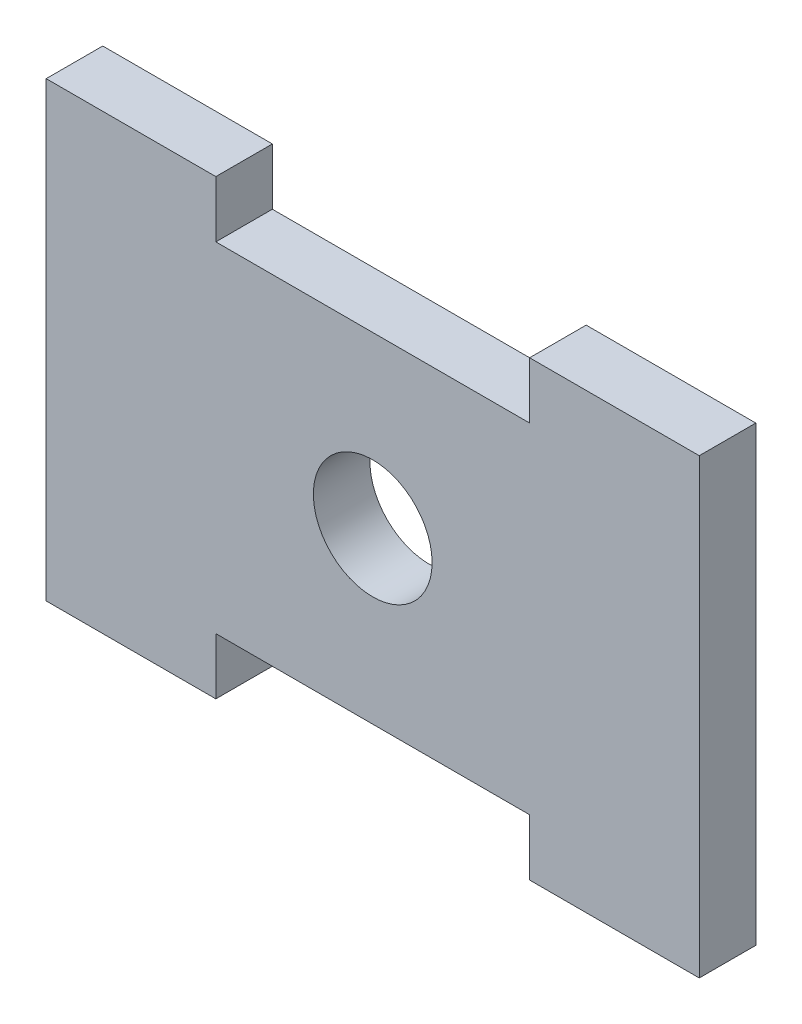
ISO-10303-21;
HEADER;
FILE_DESCRIPTION(('STEP AP214'),'2;1');
FILE_NAME('part.step','',(''),(''),'','','');
FILE_SCHEMA(('AUTOMOTIVE_DESIGN { 1 0 10303 214 1 1 1 1 }'));
ENDSEC;
DATA;
#1=APPLICATION_CONTEXT('core data for automotive mechanical design processes');
#2=APPLICATION_PROTOCOL_DEFINITION('international standard','automotive_design',2000,#1);
#3=PRODUCT_CONTEXT('',#1,'mechanical');
#4=PRODUCT('Part','Part','',(#3));
#5=PRODUCT_RELATED_PRODUCT_CATEGORY('part','',(#4));
#6=PRODUCT_DEFINITION_FORMATION('','',#4);
#7=PRODUCT_DEFINITION_CONTEXT('part definition',#1,'design');
#8=PRODUCT_DEFINITION('design','',#6,#7);
#9=PRODUCT_DEFINITION_SHAPE('','',#8);
#10=(LENGTH_UNIT() NAMED_UNIT(*) SI_UNIT(.MILLI.,.METRE.));
#11=(NAMED_UNIT(*) PLANE_ANGLE_UNIT() SI_UNIT($,.RADIAN.));
#12=(NAMED_UNIT(*) SI_UNIT($,.STERADIAN.) SOLID_ANGLE_UNIT());
#13=UNCERTAINTY_MEASURE_WITH_UNIT(LENGTH_MEASURE(1.E-05),#10,'distance_accuracy_value','');
#14=(GEOMETRIC_REPRESENTATION_CONTEXT(3) GLOBAL_UNCERTAINTY_ASSIGNED_CONTEXT((#13)) GLOBAL_UNIT_ASSIGNED_CONTEXT((#10,
#11,#12)) REPRESENTATION_CONTEXT('',''));
#15=CARTESIAN_POINT('',(0.,0.,0.));
#16=DIRECTION('',(0.,0.,1.));
#17=DIRECTION('',(1.,0.,0.));
#18=AXIS2_PLACEMENT_3D('',#15,#16,#17);
#19=CARTESIAN_POINT('',(0.,0.,2.));
#20=DIRECTION('',(0.,0.,-1.));
#21=DIRECTION('',(-1.,0.,0.));
#22=AXIS2_PLACEMENT_3D('',#19,#20,#21);
#23=PLANE('',#22);
#24=DIRECTION('',(-1.,0.,0.));
#25=VECTOR('',#24,1.);
#26=CARTESIAN_POINT('',(3.,-1.,2.));
#27=LINE('',#26,#25);
#28=CARTESIAN_POINT('',(14.1,-1.,2.));
#29=VERTEX_POINT('',#28);
#30=CARTESIAN_POINT('',(3.,-1.,2.));
#31=VERTEX_POINT('',#30);
#32=EDGE_CURVE('E201',#29,#31,#27,.T.);
#33=ORIENTED_EDGE('',*,*,#32,.T.);
#34=DIRECTION('',(0.,1.,0.));
#35=VECTOR('',#34,1.);
#36=CARTESIAN_POINT('',(3.,0.999999999999999,2.));
#37=LINE('',#36,#35);
#38=CARTESIAN_POINT('',(3.,0.999999999999999,2.));
#39=VERTEX_POINT('',#38);
#40=EDGE_CURVE('E112',#31,#39,#37,.T.);
#41=ORIENTED_EDGE('',*,*,#40,.T.);
#42=DIRECTION('',(-1.,0.,0.));
#43=VECTOR('',#42,1.);
#44=CARTESIAN_POINT('',(-3.,0.999999999999999,2.));
#45=LINE('',#44,#43);
#46=CARTESIAN_POINT('',(-3.,0.999999999999999,2.));
#47=VERTEX_POINT('',#46);
#48=EDGE_CURVE('E238',#39,#47,#45,.T.);
#49=ORIENTED_EDGE('',*,*,#48,.T.);
#50=DIRECTION('',(0.,-1.,0.));
#51=VECTOR('',#50,1.);
#52=CARTESIAN_POINT('',(-3.,0.999999999999999,2.));
#53=LINE('',#52,#51);
#54=CARTESIAN_POINT('',(-3.,-15.,2.));
#55=VERTEX_POINT('',#54);
#56=EDGE_CURVE('E257',#47,#55,#53,.T.);
#57=ORIENTED_EDGE('',*,*,#56,.T.);
#58=DIRECTION('',(1.,0.,0.));
#59=VECTOR('',#58,1.);
#60=CARTESIAN_POINT('',(-3.,-15.,2.));
#61=LINE('',#60,#59);
#62=CARTESIAN_POINT('',(3.,-15.,2.));
#63=VERTEX_POINT('',#62);
#64=EDGE_CURVE('E253',#55,#63,#61,.T.);
#65=ORIENTED_EDGE('',*,*,#64,.T.);
#66=DIRECTION('',(0.,1.,0.));
#67=VECTOR('',#66,1.);
#68=CARTESIAN_POINT('',(3.,-15.,2.));
#69=LINE('',#68,#67);
#70=CARTESIAN_POINT('',(3.,-13.,2.));
#71=VERTEX_POINT('',#70);
#72=EDGE_CURVE('E256',#63,#71,#69,.T.);
#73=ORIENTED_EDGE('',*,*,#72,.T.);
#74=DIRECTION('',(1.,0.,0.));
#75=VECTOR('',#74,1.);
#76=CARTESIAN_POINT('',(3.,-13.,2.));
#77=LINE('',#76,#75);
#78=CARTESIAN_POINT('',(14.1,-13.,2.));
#79=VERTEX_POINT('',#78);
#80=EDGE_CURVE('E261',#71,#79,#77,.T.);
#81=ORIENTED_EDGE('',*,*,#80,.T.);
#82=DIRECTION('',(0.,-1.,0.));
#83=VECTOR('',#82,1.);
#84=CARTESIAN_POINT('',(14.1,-15.,2.));
#85=LINE('',#84,#83);
#86=CARTESIAN_POINT('',(14.1,-15.,2.));
#87=VERTEX_POINT('',#86);
#88=EDGE_CURVE('E268',#79,#87,#85,.T.);
#89=ORIENTED_EDGE('',*,*,#88,.T.);
#90=DIRECTION('',(1.,0.,0.));
#91=VECTOR('',#90,1.);
#92=CARTESIAN_POINT('',(20.1,-15.,2.));
#93=LINE('',#92,#91);
#94=CARTESIAN_POINT('',(20.1,-15.,2.));
#95=VERTEX_POINT('',#94);
#96=EDGE_CURVE('E143',#87,#95,#93,.T.);
#97=ORIENTED_EDGE('',*,*,#96,.T.);
#98=DIRECTION('',(0.,1.,0.));
#99=VECTOR('',#98,1.);
#100=CARTESIAN_POINT('',(20.1,-15.,2.));
#101=LINE('',#100,#99);
#102=CARTESIAN_POINT('',(20.1,0.999999999999999,2.));
#103=VERTEX_POINT('',#102);
#104=EDGE_CURVE('E137',#95,#103,#101,.T.);
#105=ORIENTED_EDGE('',*,*,#104,.T.);
#106=DIRECTION('',(-1.,0.,0.));
#107=VECTOR('',#106,1.);
#108=CARTESIAN_POINT('',(20.1,0.999999999999999,2.));
#109=LINE('',#108,#107);
#110=CARTESIAN_POINT('',(14.1,0.999999999999999,2.));
#111=VERTEX_POINT('',#110);
#112=EDGE_CURVE('E141',#103,#111,#109,.T.);
#113=ORIENTED_EDGE('',*,*,#112,.T.);
#114=DIRECTION('',(0.,-1.,0.));
#115=VECTOR('',#114,1.);
#116=CARTESIAN_POINT('',(14.1,0.999999999999999,2.));
#117=LINE('',#116,#115);
#118=EDGE_CURVE('E57',#111,#29,#117,.T.);
#119=ORIENTED_EDGE('',*,*,#118,.T.);
#120=EDGE_LOOP('',(#33,#41,#49,#57,#65,#73,#81,#89,#97,#105,#113,#119));
#121=FACE_BOUND('',#120,.T.);
#122=CARTESIAN_POINT('',(8.55,-7.,2.));
#123=DIRECTION('',(0.,0.,1.));
#124=DIRECTION('',(1.,0.,0.));
#125=AXIS2_PLACEMENT_3D('',#122,#123,#124);
#126=CIRCLE('',#125,2.1);
#127=CARTESIAN_POINT('',(10.65,-7.,2.));
#128=VERTEX_POINT('',#127);
#129=EDGE_CURVE('E169',#128,#128,#126,.T.);
#130=ORIENTED_EDGE('',*,*,#129,.F.);
#131=EDGE_LOOP('',(#130));
#132=FACE_BOUND('',#131,.T.);
#133=ADVANCED_FACE('F39',(#121,#132),#23,.F.);
#134=CARTESIAN_POINT('',(0.,0.,0.));
#135=DIRECTION('',(0.,0.,-1.));
#136=DIRECTION('',(-1.,0.,0.));
#137=AXIS2_PLACEMENT_3D('',#134,#135,#136);
#138=PLANE('',#137);
#139=DIRECTION('',(-1.,0.,0.));
#140=VECTOR('',#139,1.);
#141=CARTESIAN_POINT('',(3.,-1.,0.));
#142=LINE('',#141,#140);
#143=CARTESIAN_POINT('',(14.1,-1.,0.));
#144=VERTEX_POINT('',#143);
#145=CARTESIAN_POINT('',(3.,-1.,0.));
#146=VERTEX_POINT('',#145);
#147=EDGE_CURVE('E164',#144,#146,#142,.T.);
#148=ORIENTED_EDGE('',*,*,#147,.F.);
#149=DIRECTION('',(0.,-1.,0.));
#150=VECTOR('',#149,1.);
#151=CARTESIAN_POINT('',(14.1,0.999999999999999,0.));
#152=LINE('',#151,#150);
#153=CARTESIAN_POINT('',(14.1,0.999999999999999,0.));
#154=VERTEX_POINT('',#153);
#155=EDGE_CURVE('E104',#154,#144,#152,.T.);
#156=ORIENTED_EDGE('',*,*,#155,.F.);
#157=DIRECTION('',(-1.,0.,0.));
#158=VECTOR('',#157,1.);
#159=CARTESIAN_POINT('',(20.1,0.999999999999999,0.));
#160=LINE('',#159,#158);
#161=CARTESIAN_POINT('',(20.1,0.999999999999999,0.));
#162=VERTEX_POINT('',#161);
#163=EDGE_CURVE('E98',#162,#154,#160,.T.);
#164=ORIENTED_EDGE('',*,*,#163,.F.);
#165=DIRECTION('',(0.,1.,0.));
#166=VECTOR('',#165,1.);
#167=CARTESIAN_POINT('',(20.1,0.999999999999999,0.));
#168=LINE('',#167,#166);
#169=CARTESIAN_POINT('',(20.1,-15.,0.));
#170=VERTEX_POINT('',#169);
#171=EDGE_CURVE('E151',#170,#162,#168,.T.);
#172=ORIENTED_EDGE('',*,*,#171,.F.);
#173=DIRECTION('',(1.,0.,0.));
#174=VECTOR('',#173,1.);
#175=CARTESIAN_POINT('',(20.1,-15.,0.));
#176=LINE('',#175,#174);
#177=CARTESIAN_POINT('',(14.1,-15.,0.));
#178=VERTEX_POINT('',#177);
#179=EDGE_CURVE('E191',#178,#170,#176,.T.);
#180=ORIENTED_EDGE('',*,*,#179,.F.);
#181=DIRECTION('',(0.,-1.,0.));
#182=VECTOR('',#181,1.);
#183=CARTESIAN_POINT('',(14.1,-15.,0.));
#184=LINE('',#183,#182);
#185=CARTESIAN_POINT('',(14.1,-13.,0.));
#186=VERTEX_POINT('',#185);
#187=EDGE_CURVE('E188',#186,#178,#184,.T.);
#188=ORIENTED_EDGE('',*,*,#187,.F.);
#189=DIRECTION('',(1.,0.,0.));
#190=VECTOR('',#189,1.);
#191=CARTESIAN_POINT('',(3.,-13.,0.));
#192=LINE('',#191,#190);
#193=CARTESIAN_POINT('',(3.,-13.,0.));
#194=VERTEX_POINT('',#193);
#195=EDGE_CURVE('E185',#194,#186,#192,.T.);
#196=ORIENTED_EDGE('',*,*,#195,.F.);
#197=DIRECTION('',(0.,1.,0.));
#198=VECTOR('',#197,1.);
#199=CARTESIAN_POINT('',(3.,-15.,0.));
#200=LINE('',#199,#198);
#201=CARTESIAN_POINT('',(3.,-15.,0.));
#202=VERTEX_POINT('',#201);
#203=EDGE_CURVE('E182',#202,#194,#200,.T.);
#204=ORIENTED_EDGE('',*,*,#203,.F.);
#205=DIRECTION('',(1.,0.,0.));
#206=VECTOR('',#205,1.);
#207=CARTESIAN_POINT('',(-3.,-15.,0.));
#208=LINE('',#207,#206);
#209=CARTESIAN_POINT('',(-3.,-15.,0.));
#210=VERTEX_POINT('',#209);
#211=EDGE_CURVE('E179',#210,#202,#208,.T.);
#212=ORIENTED_EDGE('',*,*,#211,.F.);
#213=DIRECTION('',(0.,-1.,0.));
#214=VECTOR('',#213,1.);
#215=CARTESIAN_POINT('',(-3.,-15.,0.));
#216=LINE('',#215,#214);
#217=CARTESIAN_POINT('',(-3.,0.999999999999999,0.));
#218=VERTEX_POINT('',#217);
#219=EDGE_CURVE('E176',#218,#210,#216,.T.);
#220=ORIENTED_EDGE('',*,*,#219,.F.);
#221=DIRECTION('',(-1.,0.,0.));
#222=VECTOR('',#221,1.);
#223=CARTESIAN_POINT('',(-3.,0.999999999999999,0.));
#224=LINE('',#223,#222);
#225=CARTESIAN_POINT('',(3.,0.999999999999999,0.));
#226=VERTEX_POINT('',#225);
#227=EDGE_CURVE('E172',#226,#218,#224,.T.);
#228=ORIENTED_EDGE('',*,*,#227,.F.);
#229=DIRECTION('',(0.,1.,0.));
#230=VECTOR('',#229,1.);
#231=CARTESIAN_POINT('',(3.,0.999999999999999,0.));
#232=LINE('',#231,#230);
#233=EDGE_CURVE('E168',#146,#226,#232,.T.);
#234=ORIENTED_EDGE('',*,*,#233,.F.);
#235=EDGE_LOOP('',(#148,#156,#164,#172,#180,#188,#196,#204,#212,#220,#228,#234));
#236=FACE_BOUND('',#235,.T.);
#237=CARTESIAN_POINT('',(8.55,-7.,0.));
#238=DIRECTION('',(0.,0.,1.));
#239=DIRECTION('',(1.,0.,0.));
#240=AXIS2_PLACEMENT_3D('',#237,#238,#239);
#241=CIRCLE('',#240,2.1);
#242=CARTESIAN_POINT('',(10.65,-7.,0.));
#243=VERTEX_POINT('',#242);
#244=EDGE_CURVE('E429',#243,#243,#241,.T.);
#245=ORIENTED_EDGE('',*,*,#244,.T.);
#246=EDGE_LOOP('',(#245));
#247=FACE_BOUND('',#246,.T.);
#248=ADVANCED_FACE('F241',(#236,#247),#138,.T.);
#249=CARTESIAN_POINT('',(3.,-1.,2.));
#250=DIRECTION('',(0.,-1.,0.));
#251=DIRECTION('',(0.,0.,-1.));
#252=AXIS2_PLACEMENT_3D('',#249,#250,#251);
#253=PLANE('',#252);
#254=ORIENTED_EDGE('',*,*,#147,.T.);
#255=DIRECTION('',(0.,0.,-1.));
#256=VECTOR('',#255,1.);
#257=CARTESIAN_POINT('',(3.,-1.,2.));
#258=LINE('',#257,#256);
#259=EDGE_CURVE('E11',#31,#146,#258,.T.);
#260=ORIENTED_EDGE('',*,*,#259,.F.);
#261=ORIENTED_EDGE('',*,*,#32,.F.);
#262=DIRECTION('',(0.,0.,-1.));
#263=VECTOR('',#262,1.);
#264=CARTESIAN_POINT('',(14.1,-1.,2.));
#265=LINE('',#264,#263);
#266=EDGE_CURVE('E160',#29,#144,#265,.T.);
#267=ORIENTED_EDGE('',*,*,#266,.T.);
#268=EDGE_LOOP('',(#254,#260,#261,#267));
#269=FACE_BOUND('',#268,.T.);
#270=ADVANCED_FACE('F41',(#269),#253,.F.);
#271=CARTESIAN_POINT('',(3.,0.999999999999999,2.));
#272=DIRECTION('',(-1.,0.,0.));
#273=DIRECTION('',(0.,-1.,0.));
#274=AXIS2_PLACEMENT_3D('',#271,#272,#273);
#275=PLANE('',#274);
#276=ORIENTED_EDGE('',*,*,#233,.T.);
#277=DIRECTION('',(0.,0.,-1.));
#278=VECTOR('',#277,1.);
#279=CARTESIAN_POINT('',(3.,0.999999999999999,2.));
#280=LINE('',#279,#278);
#281=EDGE_CURVE('E49',#39,#226,#280,.T.);
#282=ORIENTED_EDGE('',*,*,#281,.F.);
#283=ORIENTED_EDGE('',*,*,#40,.F.);
#284=ORIENTED_EDGE('',*,*,#259,.T.);
#285=EDGE_LOOP('',(#276,#282,#283,#284));
#286=FACE_BOUND('',#285,.T.);
#287=ADVANCED_FACE('F305',(#286),#275,.F.);
#288=CARTESIAN_POINT('',(-3.,0.999999999999999,2.));
#289=DIRECTION('',(0.,-1.,0.));
#290=DIRECTION('',(0.,0.,-1.));
#291=AXIS2_PLACEMENT_3D('',#288,#289,#290);
#292=PLANE('',#291);
#293=ORIENTED_EDGE('',*,*,#227,.T.);
#294=DIRECTION('',(0.,0.,-1.));
#295=VECTOR('',#294,1.);
#296=CARTESIAN_POINT('',(-3.,0.999999999999999,2.));
#297=LINE('',#296,#295);
#298=EDGE_CURVE('E228',#47,#218,#297,.T.);
#299=ORIENTED_EDGE('',*,*,#298,.F.);
#300=ORIENTED_EDGE('',*,*,#48,.F.);
#301=ORIENTED_EDGE('',*,*,#281,.T.);
#302=EDGE_LOOP('',(#293,#299,#300,#301));
#303=FACE_BOUND('',#302,.T.);
#304=ADVANCED_FACE('F236',(#303),#292,.F.);
#305=CARTESIAN_POINT('',(-3.,-15.,2.));
#306=DIRECTION('',(1.,0.,0.));
#307=DIRECTION('',(0.,1.,0.));
#308=AXIS2_PLACEMENT_3D('',#305,#306,#307);
#309=PLANE('',#308);
#310=ORIENTED_EDGE('',*,*,#219,.T.);
#311=DIRECTION('',(0.,0.,-1.));
#312=VECTOR('',#311,1.);
#313=CARTESIAN_POINT('',(-3.,-15.,2.));
#314=LINE('',#313,#312);
#315=EDGE_CURVE('E224',#55,#210,#314,.T.);
#316=ORIENTED_EDGE('',*,*,#315,.F.);
#317=ORIENTED_EDGE('',*,*,#56,.F.);
#318=ORIENTED_EDGE('',*,*,#298,.T.);
#319=EDGE_LOOP('',(#310,#316,#317,#318));
#320=FACE_BOUND('',#319,.T.);
#321=ADVANCED_FACE('F247',(#320),#309,.F.);
#322=CARTESIAN_POINT('',(-3.,-15.,2.));
#323=DIRECTION('',(0.,1.,0.));
#324=DIRECTION('',(0.,0.,1.));
#325=AXIS2_PLACEMENT_3D('',#322,#323,#324);
#326=PLANE('',#325);
#327=ORIENTED_EDGE('',*,*,#211,.T.);
#328=DIRECTION('',(0.,0.,-1.));
#329=VECTOR('',#328,1.);
#330=CARTESIAN_POINT('',(3.,-15.,2.));
#331=LINE('',#330,#329);
#332=EDGE_CURVE('E220',#63,#202,#331,.T.);
#333=ORIENTED_EDGE('',*,*,#332,.F.);
#334=ORIENTED_EDGE('',*,*,#64,.F.);
#335=ORIENTED_EDGE('',*,*,#315,.T.);
#336=EDGE_LOOP('',(#327,#333,#334,#335));
#337=FACE_BOUND('',#336,.T.);
#338=ADVANCED_FACE('F251',(#337),#326,.F.);
#339=CARTESIAN_POINT('',(3.,-15.,2.));
#340=DIRECTION('',(-1.,0.,0.));
#341=DIRECTION('',(0.,0.,1.));
#342=AXIS2_PLACEMENT_3D('',#339,#340,#341);
#343=PLANE('',#342);
#344=ORIENTED_EDGE('',*,*,#203,.T.);
#345=DIRECTION('',(0.,0.,-1.));
#346=VECTOR('',#345,1.);
#347=CARTESIAN_POINT('',(3.,-13.,2.));
#348=LINE('',#347,#346);
#349=EDGE_CURVE('E216',#71,#194,#348,.T.);
#350=ORIENTED_EDGE('',*,*,#349,.F.);
#351=ORIENTED_EDGE('',*,*,#72,.F.);
#352=ORIENTED_EDGE('',*,*,#332,.T.);
#353=EDGE_LOOP('',(#344,#350,#351,#352));
#354=FACE_BOUND('',#353,.T.);
#355=ADVANCED_FACE('F318',(#354),#343,.F.);
#356=CARTESIAN_POINT('',(3.,-13.,2.));
#357=DIRECTION('',(0.,1.,0.));
#358=DIRECTION('',(0.,0.,1.));
#359=AXIS2_PLACEMENT_3D('',#356,#357,#358);
#360=PLANE('',#359);
#361=ORIENTED_EDGE('',*,*,#195,.T.);
#362=DIRECTION('',(0.,0.,-1.));
#363=VECTOR('',#362,1.);
#364=CARTESIAN_POINT('',(14.1,-13.,2.));
#365=LINE('',#364,#363);
#366=EDGE_CURVE('E212',#79,#186,#365,.T.);
#367=ORIENTED_EDGE('',*,*,#366,.F.);
#368=ORIENTED_EDGE('',*,*,#80,.F.);
#369=ORIENTED_EDGE('',*,*,#349,.T.);
#370=EDGE_LOOP('',(#361,#367,#368,#369));
#371=FACE_BOUND('',#370,.T.);
#372=ADVANCED_FACE('F321',(#371),#360,.F.);
#373=CARTESIAN_POINT('',(14.1,-15.,2.));
#374=DIRECTION('',(1.,0.,0.));
#375=DIRECTION('',(0.,0.,-1.));
#376=AXIS2_PLACEMENT_3D('',#373,#374,#375);
#377=PLANE('',#376);
#378=ORIENTED_EDGE('',*,*,#187,.T.);
#379=DIRECTION('',(0.,0.,-1.));
#380=VECTOR('',#379,1.);
#381=CARTESIAN_POINT('',(14.1,-15.,2.));
#382=LINE('',#381,#380);
#383=EDGE_CURVE('E208',#87,#178,#382,.T.);
#384=ORIENTED_EDGE('',*,*,#383,.F.);
#385=ORIENTED_EDGE('',*,*,#88,.F.);
#386=ORIENTED_EDGE('',*,*,#366,.T.);
#387=EDGE_LOOP('',(#378,#384,#385,#386));
#388=FACE_BOUND('',#387,.T.);
#389=ADVANCED_FACE('F276',(#388),#377,.F.);
#390=CARTESIAN_POINT('',(20.1,-15.,2.));
#391=DIRECTION('',(0.,1.,0.));
#392=DIRECTION('',(0.,0.,1.));
#393=AXIS2_PLACEMENT_3D('',#390,#391,#392);
#394=PLANE('',#393);
#395=ORIENTED_EDGE('',*,*,#179,.T.);
#396=DIRECTION('',(0.,0.,-1.));
#397=VECTOR('',#396,1.);
#398=CARTESIAN_POINT('',(20.1,-15.,2.));
#399=LINE('',#398,#397);
#400=EDGE_CURVE('E153',#95,#170,#399,.T.);
#401=ORIENTED_EDGE('',*,*,#400,.F.);
#402=ORIENTED_EDGE('',*,*,#96,.F.);
#403=ORIENTED_EDGE('',*,*,#383,.T.);
#404=EDGE_LOOP('',(#395,#401,#402,#403));
#405=FACE_BOUND('',#404,.T.);
#406=ADVANCED_FACE('F280',(#405),#394,.F.);
#407=CARTESIAN_POINT('',(20.1,0.999999999999999,2.));
#408=DIRECTION('',(-1.,0.,0.));
#409=DIRECTION('',(0.,0.,1.));
#410=AXIS2_PLACEMENT_3D('',#407,#408,#409);
#411=PLANE('',#410);
#412=ORIENTED_EDGE('',*,*,#171,.T.);
#413=DIRECTION('',(0.,0.,-1.));
#414=VECTOR('',#413,1.);
#415=CARTESIAN_POINT('',(20.1,0.999999999999999,2.));
#416=LINE('',#415,#414);
#417=EDGE_CURVE('E149',#103,#162,#416,.T.);
#418=ORIENTED_EDGE('',*,*,#417,.F.);
#419=ORIENTED_EDGE('',*,*,#104,.F.);
#420=ORIENTED_EDGE('',*,*,#400,.T.);
#421=EDGE_LOOP('',(#412,#418,#419,#420));
#422=FACE_BOUND('',#421,.T.);
#423=ADVANCED_FACE('F150',(#422),#411,.F.);
#424=CARTESIAN_POINT('',(20.1,0.999999999999999,2.));
#425=DIRECTION('',(0.,-1.,0.));
#426=DIRECTION('',(0.,0.,-1.));
#427=AXIS2_PLACEMENT_3D('',#424,#425,#426);
#428=PLANE('',#427);
#429=ORIENTED_EDGE('',*,*,#163,.T.);
#430=DIRECTION('',(0.,0.,-1.));
#431=VECTOR('',#430,1.);
#432=CARTESIAN_POINT('',(14.1,0.999999999999999,2.));
#433=LINE('',#432,#431);
#434=EDGE_CURVE('E154',#111,#154,#433,.T.);
#435=ORIENTED_EDGE('',*,*,#434,.F.);
#436=ORIENTED_EDGE('',*,*,#112,.F.);
#437=ORIENTED_EDGE('',*,*,#417,.T.);
#438=EDGE_LOOP('',(#429,#435,#436,#437));
#439=FACE_BOUND('',#438,.T.);
#440=ADVANCED_FACE('F156',(#439),#428,.F.);
#441=CARTESIAN_POINT('',(14.1,0.999999999999999,2.));
#442=DIRECTION('',(1.,0.,0.));
#443=DIRECTION('',(0.,0.,-1.));
#444=AXIS2_PLACEMENT_3D('',#441,#442,#443);
#445=PLANE('',#444);
#446=ORIENTED_EDGE('',*,*,#155,.T.);
#447=ORIENTED_EDGE('',*,*,#266,.F.);
#448=ORIENTED_EDGE('',*,*,#118,.F.);
#449=ORIENTED_EDGE('',*,*,#434,.T.);
#450=EDGE_LOOP('',(#446,#447,#448,#449));
#451=FACE_BOUND('',#450,.T.);
#452=ADVANCED_FACE('F285',(#451),#445,.F.);
#453=CARTESIAN_POINT('',(8.55,-7.,2.));
#454=DIRECTION('',(0.,0.,-1.));
#455=DIRECTION('',(-1.,0.,0.));
#456=AXIS2_PLACEMENT_3D('',#453,#454,#455);
#457=CYLINDRICAL_SURFACE('',#456,2.1);
#458=ORIENTED_EDGE('',*,*,#129,.T.);
#459=EDGE_LOOP('',(#458));
#460=FACE_BOUND('',#459,.T.);
#461=ORIENTED_EDGE('',*,*,#244,.F.);
#462=EDGE_LOOP('',(#461));
#463=FACE_BOUND('',#462,.T.);
#464=ADVANCED_FACE('F287',(#460,#463),#457,.F.);
#465=CLOSED_SHELL('',(#133,#248,#270,#287,#304,#321,#338,#355,#372,#389,#406,#423,#440,#452,#464));
#466=MANIFOLD_SOLID_BREP('B2',#465);
#467=ADVANCED_BREP_SHAPE_REPRESENTATION('',(#18,#466),#14);
#468=SHAPE_DEFINITION_REPRESENTATION(#9,#467);
ENDSEC;
END-ISO-10303-21;
